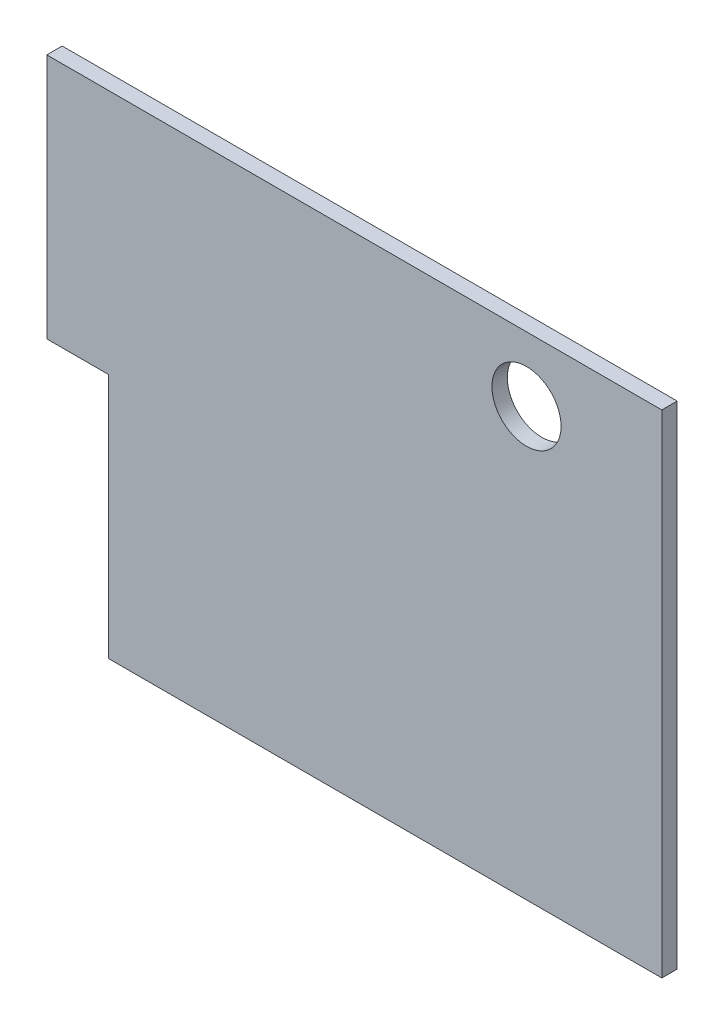
ISO-10303-21;
HEADER;
FILE_DESCRIPTION(('STEP AP214'),'2;1');
FILE_NAME('part.step','',(''),(''),'','','');
FILE_SCHEMA(('AUTOMOTIVE_DESIGN { 1 0 10303 214 1 1 1 1 }'));
ENDSEC;
DATA;
#1=APPLICATION_CONTEXT('core data for automotive mechanical design processes');
#2=APPLICATION_PROTOCOL_DEFINITION('international standard','automotive_design',2000,#1);
#3=PRODUCT_CONTEXT('',#1,'mechanical');
#4=PRODUCT('Part','Part','',(#3));
#5=PRODUCT_RELATED_PRODUCT_CATEGORY('part','',(#4));
#6=PRODUCT_DEFINITION_FORMATION('','',#4);
#7=PRODUCT_DEFINITION_CONTEXT('part definition',#1,'design');
#8=PRODUCT_DEFINITION('design','',#6,#7);
#9=PRODUCT_DEFINITION_SHAPE('','',#8);
#10=(LENGTH_UNIT() NAMED_UNIT(*) SI_UNIT(.MILLI.,.METRE.));
#11=(NAMED_UNIT(*) PLANE_ANGLE_UNIT() SI_UNIT($,.RADIAN.));
#12=(NAMED_UNIT(*) SI_UNIT($,.STERADIAN.) SOLID_ANGLE_UNIT());
#13=UNCERTAINTY_MEASURE_WITH_UNIT(LENGTH_MEASURE(1.E-05),#10,'distance_accuracy_value','');
#14=(GEOMETRIC_REPRESENTATION_CONTEXT(3) GLOBAL_UNCERTAINTY_ASSIGNED_CONTEXT((#13)) GLOBAL_UNIT_ASSIGNED_CONTEXT((#10,
#11,#12)) REPRESENTATION_CONTEXT('',''));
#15=CARTESIAN_POINT('',(0.,0.,0.));
#16=DIRECTION('',(0.,0.,1.));
#17=DIRECTION('',(1.,0.,0.));
#18=AXIS2_PLACEMENT_3D('',#15,#16,#17);
#19=CARTESIAN_POINT('',(127.,-101.6,6.35));
#20=DIRECTION('',(-1.,0.,0.));
#21=DIRECTION('',(0.,0.,1.));
#22=AXIS2_PLACEMENT_3D('',#19,#20,#21);
#23=PLANE('',#22);
#24=DIRECTION('',(0.,1.,0.));
#25=VECTOR('',#24,1.);
#26=CARTESIAN_POINT('',(127.,-101.6,0.));
#27=LINE('',#26,#25);
#28=CARTESIAN_POINT('',(127.,-101.6,0.));
#29=VERTEX_POINT('',#28);
#30=CARTESIAN_POINT('',(127.,101.6,0.));
#31=VERTEX_POINT('',#30);
#32=EDGE_CURVE('E126',#29,#31,#27,.T.);
#33=ORIENTED_EDGE('',*,*,#32,.T.);
#34=DIRECTION('',(0.,0.,-1.));
#35=VECTOR('',#34,1.);
#36=CARTESIAN_POINT('',(127.,101.6,6.35));
#37=LINE('',#36,#35);
#38=CARTESIAN_POINT('',(127.,101.6,6.35));
#39=VERTEX_POINT('',#38);
#40=EDGE_CURVE('E11',#39,#31,#37,.T.);
#41=ORIENTED_EDGE('',*,*,#40,.F.);
#42=DIRECTION('',(0.,1.,0.));
#43=VECTOR('',#42,1.);
#44=CARTESIAN_POINT('',(127.,-101.6,6.35));
#45=LINE('',#44,#43);
#46=CARTESIAN_POINT('',(127.,-101.6,6.35));
#47=VERTEX_POINT('',#46);
#48=EDGE_CURVE('E122',#47,#39,#45,.T.);
#49=ORIENTED_EDGE('',*,*,#48,.F.);
#50=DIRECTION('',(0.,0.,-1.));
#51=VECTOR('',#50,1.);
#52=CARTESIAN_POINT('',(127.,-101.6,6.35));
#53=LINE('',#52,#51);
#54=EDGE_CURVE('E120',#47,#29,#53,.T.);
#55=ORIENTED_EDGE('',*,*,#54,.T.);
#56=EDGE_LOOP('',(#33,#41,#49,#55));
#57=FACE_BOUND('',#56,.T.);
#58=ADVANCED_FACE('F39',(#57),#23,.F.);
#59=CARTESIAN_POINT('',(-127.,101.6,6.35));
#60=DIRECTION('',(0.,-1.,0.));
#61=DIRECTION('',(0.,0.,-1.));
#62=AXIS2_PLACEMENT_3D('',#59,#60,#61);
#63=PLANE('',#62);
#64=DIRECTION('',(-1.,0.,0.));
#65=VECTOR('',#64,1.);
#66=CARTESIAN_POINT('',(-127.,101.6,0.));
#67=LINE('',#66,#65);
#68=CARTESIAN_POINT('',(-127.,101.6,0.));
#69=VERTEX_POINT('',#68);
#70=EDGE_CURVE('E129',#31,#69,#67,.T.);
#71=ORIENTED_EDGE('',*,*,#70,.T.);
#72=DIRECTION('',(0.,0.,-1.));
#73=VECTOR('',#72,1.);
#74=CARTESIAN_POINT('',(-127.,101.6,6.35));
#75=LINE('',#74,#73);
#76=CARTESIAN_POINT('',(-127.,101.6,6.35));
#77=VERTEX_POINT('',#76);
#78=EDGE_CURVE('E46',#77,#69,#75,.T.);
#79=ORIENTED_EDGE('',*,*,#78,.F.);
#80=DIRECTION('',(-1.,0.,0.));
#81=VECTOR('',#80,1.);
#82=CARTESIAN_POINT('',(-127.,101.6,6.35));
#83=LINE('',#82,#81);
#84=EDGE_CURVE('E85',#39,#77,#83,.T.);
#85=ORIENTED_EDGE('',*,*,#84,.F.);
#86=ORIENTED_EDGE('',*,*,#40,.T.);
#87=EDGE_LOOP('',(#71,#79,#85,#86));
#88=FACE_BOUND('',#87,.T.);
#89=ADVANCED_FACE('F146',(#88),#63,.F.);
#90=CARTESIAN_POINT('',(-127.,-101.6,6.35));
#91=DIRECTION('',(1.,0.,0.));
#92=DIRECTION('',(0.,0.,-1.));
#93=AXIS2_PLACEMENT_3D('',#90,#91,#92);
#94=PLANE('',#93);
#95=DIRECTION('',(0.,-1.,0.));
#96=VECTOR('',#95,1.);
#97=CARTESIAN_POINT('',(-127.,-101.6,0.));
#98=LINE('',#97,#96);
#99=CARTESIAN_POINT('',(-127.,0.,0.));
#100=VERTEX_POINT('',#99);
#101=EDGE_CURVE('E116',#69,#100,#98,.T.);
#102=ORIENTED_EDGE('',*,*,#101,.T.);
#103=DIRECTION('',(0.,0.,1.));
#104=VECTOR('',#103,1.);
#105=CARTESIAN_POINT('',(-127.,0.,0.));
#106=LINE('',#105,#104);
#107=CARTESIAN_POINT('',(-127.,0.,6.35));
#108=VERTEX_POINT('',#107);
#109=EDGE_CURVE('E102',#100,#108,#106,.T.);
#110=ORIENTED_EDGE('',*,*,#109,.T.);
#111=DIRECTION('',(0.,-1.,0.));
#112=VECTOR('',#111,1.);
#113=CARTESIAN_POINT('',(-127.,-101.6,6.35));
#114=LINE('',#113,#112);
#115=EDGE_CURVE('E114',#77,#108,#114,.T.);
#116=ORIENTED_EDGE('',*,*,#115,.F.);
#117=ORIENTED_EDGE('',*,*,#78,.T.);
#118=EDGE_LOOP('',(#102,#110,#116,#117));
#119=FACE_BOUND('',#118,.T.);
#120=ADVANCED_FACE('F112',(#119),#94,.F.);
#121=CARTESIAN_POINT('',(-127.,-101.6,6.35));
#122=DIRECTION('',(0.,1.,0.));
#123=DIRECTION('',(0.,0.,1.));
#124=AXIS2_PLACEMENT_3D('',#121,#122,#123);
#125=PLANE('',#124);
#126=DIRECTION('',(1.,0.,0.));
#127=VECTOR('',#126,1.);
#128=CARTESIAN_POINT('',(-127.,-101.6,6.35));
#129=LINE('',#128,#127);
#130=CARTESIAN_POINT('',(-101.6,-101.6,6.35));
#131=VERTEX_POINT('',#130);
#132=EDGE_CURVE('E62',#131,#47,#129,.T.);
#133=ORIENTED_EDGE('',*,*,#132,.F.);
#134=DIRECTION('',(0.,0.,1.));
#135=VECTOR('',#134,1.);
#136=CARTESIAN_POINT('',(-101.6,-101.6,0.));
#137=LINE('',#136,#135);
#138=CARTESIAN_POINT('',(-101.6,-101.6,0.));
#139=VERTEX_POINT('',#138);
#140=EDGE_CURVE('E138',#139,#131,#137,.T.);
#141=ORIENTED_EDGE('',*,*,#140,.F.);
#142=DIRECTION('',(1.,0.,0.));
#143=VECTOR('',#142,1.);
#144=CARTESIAN_POINT('',(-127.,-101.6,0.));
#145=LINE('',#144,#143);
#146=EDGE_CURVE('E80',#139,#29,#145,.T.);
#147=ORIENTED_EDGE('',*,*,#146,.T.);
#148=ORIENTED_EDGE('',*,*,#54,.F.);
#149=EDGE_LOOP('',(#133,#141,#147,#148));
#150=FACE_BOUND('',#149,.T.);
#151=ADVANCED_FACE('F152',(#150),#125,.F.);
#152=CARTESIAN_POINT('',(0.,0.,6.35));
#153=DIRECTION('',(0.,0.,-1.));
#154=DIRECTION('',(-1.,0.,0.));
#155=AXIS2_PLACEMENT_3D('',#152,#153,#154);
#156=PLANE('',#155);
#157=CARTESIAN_POINT('',(71.12,74.93,6.35));
#158=DIRECTION('',(0.,0.,1.));
#159=DIRECTION('',(1.,0.,0.));
#160=AXIS2_PLACEMENT_3D('',#157,#158,#159);
#161=CIRCLE('',#160,14.2748);
#162=CARTESIAN_POINT('',(85.3948,74.93,6.35));
#163=VERTEX_POINT('',#162);
#164=EDGE_CURVE('E179',#163,#163,#161,.T.);
#165=ORIENTED_EDGE('',*,*,#164,.F.);
#166=EDGE_LOOP('',(#165));
#167=FACE_BOUND('',#166,.T.);
#168=ORIENTED_EDGE('',*,*,#115,.T.);
#169=DIRECTION('',(-1.,0.,0.));
#170=VECTOR('',#169,1.);
#171=CARTESIAN_POINT('',(-127.,0.,6.35));
#172=LINE('',#171,#170);
#173=CARTESIAN_POINT('',(-101.6,0.,6.35));
#174=VERTEX_POINT('',#173);
#175=EDGE_CURVE('E99',#174,#108,#172,.T.);
#176=ORIENTED_EDGE('',*,*,#175,.F.);
#177=DIRECTION('',(0.,1.,0.));
#178=VECTOR('',#177,1.);
#179=CARTESIAN_POINT('',(-101.6,-101.6,6.35));
#180=LINE('',#179,#178);
#181=EDGE_CURVE('E106',#131,#174,#180,.T.);
#182=ORIENTED_EDGE('',*,*,#181,.F.);
#183=ORIENTED_EDGE('',*,*,#132,.T.);
#184=ORIENTED_EDGE('',*,*,#48,.T.);
#185=ORIENTED_EDGE('',*,*,#84,.T.);
#186=EDGE_LOOP('',(#168,#176,#182,#183,#184,#185));
#187=FACE_BOUND('',#186,.T.);
#188=ADVANCED_FACE('F118',(#167,#187),#156,.F.);
#189=CARTESIAN_POINT('',(0.,0.,0.));
#190=DIRECTION('',(0.,0.,-1.));
#191=DIRECTION('',(-1.,0.,0.));
#192=AXIS2_PLACEMENT_3D('',#189,#190,#191);
#193=PLANE('',#192);
#194=CARTESIAN_POINT('',(71.12,74.93,0.));
#195=DIRECTION('',(0.,0.,1.));
#196=DIRECTION('',(1.,0.,0.));
#197=AXIS2_PLACEMENT_3D('',#194,#195,#196);
#198=CIRCLE('',#197,14.2748);
#199=CARTESIAN_POINT('',(85.3948,74.93,0.));
#200=VERTEX_POINT('',#199);
#201=EDGE_CURVE('E130',#200,#200,#198,.T.);
#202=ORIENTED_EDGE('',*,*,#201,.T.);
#203=EDGE_LOOP('',(#202));
#204=FACE_BOUND('',#203,.T.);
#205=DIRECTION('',(-1.,0.,0.));
#206=VECTOR('',#205,1.);
#207=CARTESIAN_POINT('',(-127.,0.,0.));
#208=LINE('',#207,#206);
#209=CARTESIAN_POINT('',(-101.6,0.,0.));
#210=VERTEX_POINT('',#209);
#211=EDGE_CURVE('E53',#210,#100,#208,.T.);
#212=ORIENTED_EDGE('',*,*,#211,.T.);
#213=ORIENTED_EDGE('',*,*,#101,.F.);
#214=ORIENTED_EDGE('',*,*,#70,.F.);
#215=ORIENTED_EDGE('',*,*,#32,.F.);
#216=ORIENTED_EDGE('',*,*,#146,.F.);
#217=DIRECTION('',(0.,1.,0.));
#218=VECTOR('',#217,1.);
#219=CARTESIAN_POINT('',(-101.6,-101.6,0.));
#220=LINE('',#219,#218);
#221=EDGE_CURVE('E107',#139,#210,#220,.T.);
#222=ORIENTED_EDGE('',*,*,#221,.T.);
#223=EDGE_LOOP('',(#212,#213,#214,#215,#216,#222));
#224=FACE_BOUND('',#223,.T.);
#225=ADVANCED_FACE('F135',(#204,#224),#193,.T.);
#226=CARTESIAN_POINT('',(-127.,0.,0.));
#227=DIRECTION('',(0.,1.,0.));
#228=DIRECTION('',(0.,0.,1.));
#229=AXIS2_PLACEMENT_3D('',#226,#227,#228);
#230=PLANE('',#229);
#231=ORIENTED_EDGE('',*,*,#175,.T.);
#232=ORIENTED_EDGE('',*,*,#109,.F.);
#233=ORIENTED_EDGE('',*,*,#211,.F.);
#234=DIRECTION('',(0.,0.,1.));
#235=VECTOR('',#234,1.);
#236=CARTESIAN_POINT('',(-101.6,0.,0.));
#237=LINE('',#236,#235);
#238=EDGE_CURVE('E103',#210,#174,#237,.T.);
#239=ORIENTED_EDGE('',*,*,#238,.T.);
#240=EDGE_LOOP('',(#231,#232,#233,#239));
#241=FACE_BOUND('',#240,.T.);
#242=ADVANCED_FACE('F101',(#241),#230,.F.);
#243=CARTESIAN_POINT('',(-101.6,-101.6,0.));
#244=DIRECTION('',(1.,0.,0.));
#245=DIRECTION('',(0.,0.,-1.));
#246=AXIS2_PLACEMENT_3D('',#243,#244,#245);
#247=PLANE('',#246);
#248=ORIENTED_EDGE('',*,*,#181,.T.);
#249=ORIENTED_EDGE('',*,*,#238,.F.);
#250=ORIENTED_EDGE('',*,*,#221,.F.);
#251=ORIENTED_EDGE('',*,*,#140,.T.);
#252=EDGE_LOOP('',(#248,#249,#250,#251));
#253=FACE_BOUND('',#252,.T.);
#254=ADVANCED_FACE('F165',(#253),#247,.F.);
#255=CARTESIAN_POINT('',(71.12,74.93,0.));
#256=DIRECTION('',(0.,0.,1.));
#257=DIRECTION('',(1.,0.,0.));
#258=AXIS2_PLACEMENT_3D('',#255,#256,#257);
#259=CYLINDRICAL_SURFACE('',#258,14.2748);
#260=ORIENTED_EDGE('',*,*,#201,.F.);
#261=EDGE_LOOP('',(#260));
#262=FACE_BOUND('',#261,.T.);
#263=ORIENTED_EDGE('',*,*,#164,.T.);
#264=EDGE_LOOP('',(#263));
#265=FACE_BOUND('',#264,.T.);
#266=ADVANCED_FACE('F168',(#262,#265),#259,.F.);
#267=CLOSED_SHELL('',(#58,#89,#120,#151,#188,#225,#242,#254,#266));
#268=MANIFOLD_SOLID_BREP('B2',#267);
#269=ADVANCED_BREP_SHAPE_REPRESENTATION('',(#18,#268),#14);
#270=SHAPE_DEFINITION_REPRESENTATION(#9,#269);
ENDSEC;
END-ISO-10303-21;
